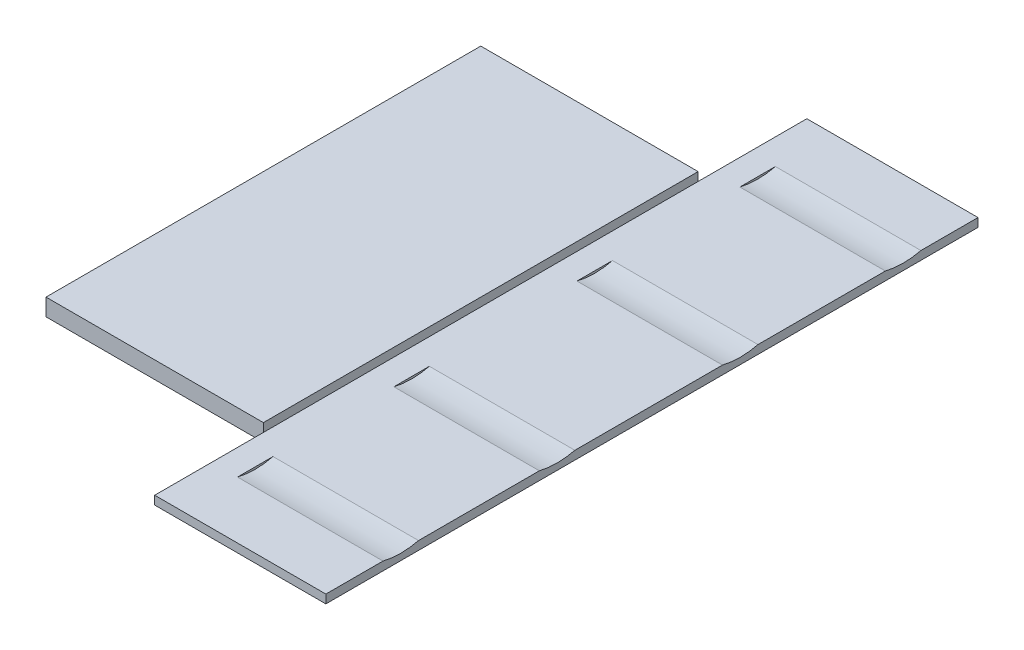
ISO-10303-21;
HEADER;
FILE_DESCRIPTION(('STEP AP214'),'2;1');
FILE_NAME('part.step','',(''),(''),'','','');
FILE_SCHEMA(('AUTOMOTIVE_DESIGN { 1 0 10303 214 1 1 1 1 }'));
ENDSEC;
DATA;
#1=APPLICATION_CONTEXT('core data for automotive mechanical design processes');
#2=APPLICATION_PROTOCOL_DEFINITION('international standard','automotive_design',2000,#1);
#3=PRODUCT_CONTEXT('',#1,'mechanical');
#4=PRODUCT('Part','Part','',(#3));
#5=PRODUCT_RELATED_PRODUCT_CATEGORY('part','',(#4));
#6=PRODUCT_DEFINITION_FORMATION('','',#4);
#7=PRODUCT_DEFINITION_CONTEXT('part definition',#1,'design');
#8=PRODUCT_DEFINITION('design','',#6,#7);
#9=PRODUCT_DEFINITION_SHAPE('','',#8);
#10=(LENGTH_UNIT() NAMED_UNIT(*) SI_UNIT(.MILLI.,.METRE.));
#11=(NAMED_UNIT(*) PLANE_ANGLE_UNIT() SI_UNIT($,.RADIAN.));
#12=(NAMED_UNIT(*) SI_UNIT($,.STERADIAN.) SOLID_ANGLE_UNIT());
#13=UNCERTAINTY_MEASURE_WITH_UNIT(LENGTH_MEASURE(1.E-05),#10,'distance_accuracy_value','');
#14=(GEOMETRIC_REPRESENTATION_CONTEXT(3) GLOBAL_UNCERTAINTY_ASSIGNED_CONTEXT((#13)) GLOBAL_UNIT_ASSIGNED_CONTEXT((#10,
#11,#12)) REPRESENTATION_CONTEXT('',''));
#15=CARTESIAN_POINT('',(0.,0.,0.));
#16=DIRECTION('',(0.,0.,1.));
#17=DIRECTION('',(1.,0.,0.));
#18=AXIS2_PLACEMENT_3D('',#15,#16,#17);
#19=CARTESIAN_POINT('',(-63.5,2.,-76.21));
#20=DIRECTION('',(0.,1.,0.));
#21=DIRECTION('',(0.,0.,1.));
#22=AXIS2_PLACEMENT_3D('',#19,#20,#21);
#23=PLANE('',#22);
#24=DIRECTION('',(1.,0.,0.));
#25=VECTOR('',#24,1.);
#26=CARTESIAN_POINT('',(0.,2.,-76.2));
#27=LINE('',#26,#25);
#28=CARTESIAN_POINT('',(-63.5,2.,-76.2));
#29=VERTEX_POINT('',#28);
#30=CARTESIAN_POINT('',(-23.5,2.,-76.2));
#31=VERTEX_POINT('',#30);
#32=EDGE_CURVE('E167',#29,#31,#27,.T.);
#33=ORIENTED_EDGE('',*,*,#32,.F.);
#34=DIRECTION('',(0.,0.,1.));
#35=VECTOR('',#34,1.);
#36=CARTESIAN_POINT('',(-63.5,2.,-76.21));
#37=LINE('',#36,#35);
#38=CARTESIAN_POINT('',(-63.5,2.,-50.8));
#39=VERTEX_POINT('',#38);
#40=EDGE_CURVE('E56',#29,#39,#37,.T.);
#41=ORIENTED_EDGE('',*,*,#40,.T.);
#42=CARTESIAN_POINT('',(-63.5,2.,50.8));
#43=VERTEX_POINT('',#42);
#44=EDGE_CURVE('E11',#39,#43,#37,.T.);
#45=ORIENTED_EDGE('',*,*,#44,.T.);
#46=CARTESIAN_POINT('',(-63.5,2.,76.2));
#47=VERTEX_POINT('',#46);
#48=EDGE_CURVE('E55',#43,#47,#37,.T.);
#49=ORIENTED_EDGE('',*,*,#48,.T.);
#50=DIRECTION('',(1.,0.,0.));
#51=VECTOR('',#50,1.);
#52=CARTESIAN_POINT('',(0.,2.,76.2));
#53=LINE('',#52,#51);
#54=CARTESIAN_POINT('',(-23.5,2.,76.2));
#55=VERTEX_POINT('',#54);
#56=EDGE_CURVE('E146',#47,#55,#53,.T.);
#57=ORIENTED_EDGE('',*,*,#56,.T.);
#58=DIRECTION('',(0.,0.,1.));
#59=VECTOR('',#58,1.);
#60=CARTESIAN_POINT('',(-23.5,2.,-76.21));
#61=LINE('',#60,#59);
#62=CARTESIAN_POINT('',(-23.5,2.00000000000001,62.8533119314591));
#63=VERTEX_POINT('',#62);
#64=EDGE_CURVE('E53',#63,#55,#61,.T.);
#65=ORIENTED_EDGE('',*,*,#64,.F.);
#66=DIRECTION('',(1.,0.,0.));
#67=VECTOR('',#66,1.);
#68=CARTESIAN_POINT('',(-57.5,2.00000000000001,62.8533119314592));
#69=LINE('',#68,#67);
#70=CARTESIAN_POINT('',(-57.5,2.,62.8533119314591));
#71=VERTEX_POINT('',#70);
#72=EDGE_CURVE('E210',#63,#71,#69,.F.);
#73=ORIENTED_EDGE('',*,*,#72,.T.);
#74=DIRECTION('',(0.,0.,1.));
#75=VECTOR('',#74,1.);
#76=CARTESIAN_POINT('',(-57.5,2.,58.7));
#77=LINE('',#76,#75);
#78=CARTESIAN_POINT('',(-57.5,2.,54.5466880685409));
#79=VERTEX_POINT('',#78);
#80=EDGE_CURVE('E155',#79,#71,#77,.T.);
#81=ORIENTED_EDGE('',*,*,#80,.F.);
#82=DIRECTION('',(1.,0.,0.));
#83=VECTOR('',#82,1.);
#84=CARTESIAN_POINT('',(-57.5,2.00000000000001,54.5466880685409));
#85=LINE('',#84,#83);
#86=CARTESIAN_POINT('',(-23.5,2.00000000000001,54.5466880685409));
#87=VERTEX_POINT('',#86);
#88=EDGE_CURVE('E216',#79,#87,#85,.T.);
#89=ORIENTED_EDGE('',*,*,#88,.T.);
#90=CARTESIAN_POINT('',(-23.5,2.00000000000001,26.3160118735668));
#91=VERTEX_POINT('',#90);
#92=EDGE_CURVE('E150',#91,#87,#61,.T.);
#93=ORIENTED_EDGE('',*,*,#92,.F.);
#94=DIRECTION('',(1.,0.,0.));
#95=VECTOR('',#94,1.);
#96=CARTESIAN_POINT('',(-57.5,2.00000000000001,26.3160118735668));
#97=LINE('',#96,#95);
#98=CARTESIAN_POINT('',(-57.5,2.,26.3160118735668));
#99=VERTEX_POINT('',#98);
#100=EDGE_CURVE('E183',#91,#99,#97,.F.);
#101=ORIENTED_EDGE('',*,*,#100,.T.);
#102=DIRECTION('',(0.,0.,1.));
#103=VECTOR('',#102,1.);
#104=CARTESIAN_POINT('',(-57.5,2.,22.1626999421077));
#105=LINE('',#104,#103);
#106=CARTESIAN_POINT('',(-57.5,2.,18.0093880106486));
#107=VERTEX_POINT('',#106);
#108=EDGE_CURVE('E164',#107,#99,#105,.T.);
#109=ORIENTED_EDGE('',*,*,#108,.F.);
#110=DIRECTION('',(1.,0.,0.));
#111=VECTOR('',#110,1.);
#112=CARTESIAN_POINT('',(-57.5,2.00000000000001,18.0093880106486));
#113=LINE('',#112,#111);
#114=CARTESIAN_POINT('',(-23.5,2.00000000000001,18.0093880106486));
#115=VERTEX_POINT('',#114);
#116=EDGE_CURVE('E189',#107,#115,#113,.T.);
#117=ORIENTED_EDGE('',*,*,#116,.T.);
#118=CARTESIAN_POINT('',(-23.5,2.00000000000001,-16.4795633231839));
#119=VERTEX_POINT('',#118);
#120=EDGE_CURVE('E244',#119,#115,#61,.T.);
#121=ORIENTED_EDGE('',*,*,#120,.F.);
#122=DIRECTION('',(1.,0.,0.));
#123=VECTOR('',#122,1.);
#124=CARTESIAN_POINT('',(-57.5,2.00000000000001,-16.4795633231839));
#125=LINE('',#124,#123);
#126=CARTESIAN_POINT('',(-57.5,2.,-16.4795633231839));
#127=VERTEX_POINT('',#126);
#128=EDGE_CURVE('E201',#119,#127,#125,.F.);
#129=ORIENTED_EDGE('',*,*,#128,.T.);
#130=DIRECTION('',(0.,0.,1.));
#131=VECTOR('',#130,1.);
#132=CARTESIAN_POINT('',(-57.5,2.,-20.632875254643));
#133=LINE('',#132,#131);
#134=CARTESIAN_POINT('',(-57.5,2.,-24.786187186102));
#135=VERTEX_POINT('',#134);
#136=EDGE_CURVE('E158',#135,#127,#133,.T.);
#137=ORIENTED_EDGE('',*,*,#136,.F.);
#138=DIRECTION('',(1.,0.,0.));
#139=VECTOR('',#138,1.);
#140=CARTESIAN_POINT('',(-57.5,2.00000000000001,-24.7861871861021));
#141=LINE('',#140,#139);
#142=CARTESIAN_POINT('',(-23.5,2.00000000000001,-24.7861871861021));
#143=VERTEX_POINT('',#142);
#144=EDGE_CURVE('E207',#135,#143,#141,.T.);
#145=ORIENTED_EDGE('',*,*,#144,.T.);
#146=CARTESIAN_POINT('',(-23.5,2.00000000000001,-54.5466880685409));
#147=VERTEX_POINT('',#146);
#148=EDGE_CURVE('E238',#147,#143,#61,.T.);
#149=ORIENTED_EDGE('',*,*,#148,.F.);
#150=DIRECTION('',(1.,0.,0.));
#151=VECTOR('',#150,1.);
#152=CARTESIAN_POINT('',(-57.5,2.00000000000001,-54.5466880685409));
#153=LINE('',#152,#151);
#154=CARTESIAN_POINT('',(-57.5,2.,-54.5466880685409));
#155=VERTEX_POINT('',#154);
#156=EDGE_CURVE('E192',#147,#155,#153,.F.);
#157=ORIENTED_EDGE('',*,*,#156,.T.);
#158=DIRECTION('',(0.,0.,1.));
#159=VECTOR('',#158,1.);
#160=CARTESIAN_POINT('',(-57.5,2.,-58.7));
#161=LINE('',#160,#159);
#162=CARTESIAN_POINT('',(-57.5,2.,-62.8533119314591));
#163=VERTEX_POINT('',#162);
#164=EDGE_CURVE('E161',#163,#155,#161,.T.);
#165=ORIENTED_EDGE('',*,*,#164,.F.);
#166=DIRECTION('',(1.,0.,0.));
#167=VECTOR('',#166,1.);
#168=CARTESIAN_POINT('',(-57.5,2.00000000000001,-62.8533119314591));
#169=LINE('',#168,#167);
#170=CARTESIAN_POINT('',(-23.5,2.00000000000001,-62.8533119314591));
#171=VERTEX_POINT('',#170);
#172=EDGE_CURVE('E198',#163,#171,#169,.T.);
#173=ORIENTED_EDGE('',*,*,#172,.T.);
#174=EDGE_CURVE('E151',#31,#171,#61,.T.);
#175=ORIENTED_EDGE('',*,*,#174,.F.);
#176=EDGE_LOOP('',(#33,#41,#45,#49,#57,#65,#73,#81,#89,#93,#101,#109,#117,#121,#129,#137,#145,
#149,#157,#165,#173,#175));
#177=FACE_BOUND('',#176,.T.);
#178=ADVANCED_FACE('F43',(#177),#23,.T.);
#179=CARTESIAN_POINT('',(-63.5,2.,-76.21));
#180=DIRECTION('',(1.,0.,0.));
#181=DIRECTION('',(0.,0.,-1.));
#182=AXIS2_PLACEMENT_3D('',#179,#180,#181);
#183=PLANE('',#182);
#184=DIRECTION('',(0.,0.,-1.));
#185=VECTOR('',#184,1.);
#186=CARTESIAN_POINT('',(-63.5,4.,0.));
#187=LINE('',#186,#185);
#188=CARTESIAN_POINT('',(-63.5,4.,50.8));
#189=VERTEX_POINT('',#188);
#190=CARTESIAN_POINT('',(-63.5,4.,-50.8));
#191=VERTEX_POINT('',#190);
#192=EDGE_CURVE('E173',#189,#191,#187,.T.);
#193=ORIENTED_EDGE('',*,*,#192,.F.);
#194=DIRECTION('',(0.,-1.,0.));
#195=VECTOR('',#194,1.);
#196=CARTESIAN_POINT('',(-63.5,4.,50.8));
#197=LINE('',#196,#195);
#198=EDGE_CURVE('E116',#189,#43,#197,.T.);
#199=ORIENTED_EDGE('',*,*,#198,.T.);
#200=ORIENTED_EDGE('',*,*,#44,.F.);
#201=DIRECTION('',(0.,-1.,0.));
#202=VECTOR('',#201,1.);
#203=CARTESIAN_POINT('',(-63.5,4.,-50.8));
#204=LINE('',#203,#202);
#205=EDGE_CURVE('E152',#191,#39,#204,.T.);
#206=ORIENTED_EDGE('',*,*,#205,.F.);
#207=EDGE_LOOP('',(#193,#199,#200,#206));
#208=FACE_BOUND('',#207,.T.);
#209=ADVANCED_FACE('F315',(#208),#183,.T.);
#210=CARTESIAN_POINT('',(-23.5,2.,-76.21));
#211=DIRECTION('',(1.,0.,0.));
#212=DIRECTION('',(0.,0.,-1.));
#213=AXIS2_PLACEMENT_3D('',#210,#211,#212);
#214=PLANE('',#213);
#215=DIRECTION('',(0.,-1.,0.));
#216=VECTOR('',#215,1.);
#217=CARTESIAN_POINT('',(-23.5,4.,-76.2));
#218=LINE('',#217,#216);
#219=CARTESIAN_POINT('',(-23.5,0.,-76.2));
#220=VERTEX_POINT('',#219);
#221=EDGE_CURVE('E170',#31,#220,#218,.T.);
#222=ORIENTED_EDGE('',*,*,#221,.F.);
#223=ORIENTED_EDGE('',*,*,#174,.T.);
#224=CARTESIAN_POINT('',(-23.5,19.,-58.7));
#225=DIRECTION('',(1.,0.,0.));
#226=DIRECTION('',(0.,0.,-1.));
#227=AXIS2_PLACEMENT_3D('',#224,#225,#226);
#228=CIRCLE('',#227,17.5);
#229=EDGE_CURVE('E195',#171,#147,#228,.F.);
#230=ORIENTED_EDGE('',*,*,#229,.T.);
#231=ORIENTED_EDGE('',*,*,#148,.T.);
#232=CARTESIAN_POINT('',(-23.5,19.,-20.632875254643));
#233=DIRECTION('',(1.,0.,0.));
#234=DIRECTION('',(0.,0.,-1.));
#235=AXIS2_PLACEMENT_3D('',#232,#233,#234);
#236=CIRCLE('',#235,17.5);
#237=EDGE_CURVE('E204',#143,#119,#236,.F.);
#238=ORIENTED_EDGE('',*,*,#237,.T.);
#239=ORIENTED_EDGE('',*,*,#120,.T.);
#240=CARTESIAN_POINT('',(-23.5,19.,22.1626999421077));
#241=DIRECTION('',(1.,0.,0.));
#242=DIRECTION('',(0.,0.,-1.));
#243=AXIS2_PLACEMENT_3D('',#240,#241,#242);
#244=CIRCLE('',#243,17.5);
#245=EDGE_CURVE('E186',#115,#91,#244,.F.);
#246=ORIENTED_EDGE('',*,*,#245,.T.);
#247=ORIENTED_EDGE('',*,*,#92,.T.);
#248=CARTESIAN_POINT('',(-23.5,19.,58.7));
#249=DIRECTION('',(1.,0.,0.));
#250=DIRECTION('',(0.,0.,-1.));
#251=AXIS2_PLACEMENT_3D('',#248,#249,#250);
#252=CIRCLE('',#251,17.5);
#253=EDGE_CURVE('E213',#87,#63,#252,.F.);
#254=ORIENTED_EDGE('',*,*,#253,.T.);
#255=ORIENTED_EDGE('',*,*,#64,.T.);
#256=DIRECTION('',(0.,-1.,0.));
#257=VECTOR('',#256,1.);
#258=CARTESIAN_POINT('',(-23.5,4.,76.2));
#259=LINE('',#258,#257);
#260=CARTESIAN_POINT('',(-23.5,0.,76.2));
#261=VERTEX_POINT('',#260);
#262=EDGE_CURVE('E176',#55,#261,#259,.T.);
#263=ORIENTED_EDGE('',*,*,#262,.T.);
#264=DIRECTION('',(0.,0.,-1.));
#265=VECTOR('',#264,1.);
#266=CARTESIAN_POINT('',(-23.5,0.,0.));
#267=LINE('',#266,#265);
#268=EDGE_CURVE('E147',#261,#220,#267,.T.);
#269=ORIENTED_EDGE('',*,*,#268,.T.);
#270=EDGE_LOOP('',(#222,#223,#230,#231,#238,#239,#246,#247,#254,#255,#263,#269));
#271=FACE_BOUND('',#270,.T.);
#272=ADVANCED_FACE('F253',(#271),#214,.T.);
#273=CARTESIAN_POINT('',(-57.5,19.,58.7));
#274=DIRECTION('',(1.,0.,0.));
#275=DIRECTION('',(0.,0.,-1.));
#276=AXIS2_PLACEMENT_3D('',#273,#274,#275);
#277=CYLINDRICAL_SURFACE('',#276,17.5);
#278=ORIENTED_EDGE('',*,*,#72,.F.);
#279=ORIENTED_EDGE('',*,*,#253,.F.);
#280=ORIENTED_EDGE('',*,*,#88,.F.);
#281=CARTESIAN_POINT('',(-57.5,19.,58.7));
#282=DIRECTION('',(1.,0.,0.));
#283=DIRECTION('',(0.,0.,-1.));
#284=AXIS2_PLACEMENT_3D('',#281,#282,#283);
#285=CIRCLE('',#284,17.5);
#286=EDGE_CURVE('E139',#71,#79,#285,.T.);
#287=ORIENTED_EDGE('',*,*,#286,.F.);
#288=EDGE_LOOP('',(#278,#279,#280,#287));
#289=FACE_BOUND('',#288,.T.);
#290=ADVANCED_FACE('F268',(#289),#277,.F.);
#291=CARTESIAN_POINT('',(-57.5,19.,58.7));
#292=DIRECTION('',(1.,0.,0.));
#293=DIRECTION('',(0.,0.,-1.));
#294=AXIS2_PLACEMENT_3D('',#291,#292,#293);
#295=PLANE('',#294);
#296=ORIENTED_EDGE('',*,*,#286,.T.);
#297=ORIENTED_EDGE('',*,*,#80,.T.);
#298=EDGE_LOOP('',(#296,#297));
#299=FACE_BOUND('',#298,.T.);
#300=ADVANCED_FACE('F334',(#299),#295,.T.);
#301=CARTESIAN_POINT('',(-57.5,19.,-20.632875254643));
#302=DIRECTION('',(1.,0.,0.));
#303=DIRECTION('',(0.,0.,-1.));
#304=AXIS2_PLACEMENT_3D('',#301,#302,#303);
#305=CYLINDRICAL_SURFACE('',#304,17.5);
#306=ORIENTED_EDGE('',*,*,#128,.F.);
#307=ORIENTED_EDGE('',*,*,#237,.F.);
#308=ORIENTED_EDGE('',*,*,#144,.F.);
#309=CARTESIAN_POINT('',(-57.5,19.,-20.632875254643));
#310=DIRECTION('',(1.,0.,0.));
#311=DIRECTION('',(0.,0.,-1.));
#312=AXIS2_PLACEMENT_3D('',#309,#310,#311);
#313=CIRCLE('',#312,17.5);
#314=EDGE_CURVE('E47',#127,#135,#313,.T.);
#315=ORIENTED_EDGE('',*,*,#314,.F.);
#316=EDGE_LOOP('',(#306,#307,#308,#315));
#317=FACE_BOUND('',#316,.T.);
#318=ADVANCED_FACE('F340',(#317),#305,.F.);
#319=CARTESIAN_POINT('',(-57.5,19.,-20.632875254643));
#320=DIRECTION('',(1.,0.,0.));
#321=DIRECTION('',(0.,0.,-1.));
#322=AXIS2_PLACEMENT_3D('',#319,#320,#321);
#323=PLANE('',#322);
#324=ORIENTED_EDGE('',*,*,#314,.T.);
#325=ORIENTED_EDGE('',*,*,#136,.T.);
#326=EDGE_LOOP('',(#324,#325));
#327=FACE_BOUND('',#326,.T.);
#328=ADVANCED_FACE('F348',(#327),#323,.T.);
#329=CARTESIAN_POINT('',(-57.5,19.,-58.7));
#330=DIRECTION('',(1.,0.,0.));
#331=DIRECTION('',(0.,0.,-1.));
#332=AXIS2_PLACEMENT_3D('',#329,#330,#331);
#333=CYLINDRICAL_SURFACE('',#332,17.5);
#334=ORIENTED_EDGE('',*,*,#156,.F.);
#335=ORIENTED_EDGE('',*,*,#229,.F.);
#336=ORIENTED_EDGE('',*,*,#172,.F.);
#337=CARTESIAN_POINT('',(-57.5,19.,-58.7));
#338=DIRECTION('',(1.,0.,0.));
#339=DIRECTION('',(0.,0.,-1.));
#340=AXIS2_PLACEMENT_3D('',#337,#338,#339);
#341=CIRCLE('',#340,17.5);
#342=EDGE_CURVE('E228',#155,#163,#341,.T.);
#343=ORIENTED_EDGE('',*,*,#342,.F.);
#344=EDGE_LOOP('',(#334,#335,#336,#343));
#345=FACE_BOUND('',#344,.T.);
#346=ADVANCED_FACE('F352',(#345),#333,.F.);
#347=CARTESIAN_POINT('',(-57.5,19.,-58.7));
#348=DIRECTION('',(1.,0.,0.));
#349=DIRECTION('',(0.,0.,-1.));
#350=AXIS2_PLACEMENT_3D('',#347,#348,#349);
#351=PLANE('',#350);
#352=ORIENTED_EDGE('',*,*,#342,.T.);
#353=ORIENTED_EDGE('',*,*,#164,.T.);
#354=EDGE_LOOP('',(#352,#353));
#355=FACE_BOUND('',#354,.T.);
#356=ADVANCED_FACE('F355',(#355),#351,.T.);
#357=CARTESIAN_POINT('',(-57.5,19.,22.1626999421077));
#358=DIRECTION('',(1.,0.,0.));
#359=DIRECTION('',(0.,0.,-1.));
#360=AXIS2_PLACEMENT_3D('',#357,#358,#359);
#361=CYLINDRICAL_SURFACE('',#360,17.5);
#362=ORIENTED_EDGE('',*,*,#100,.F.);
#363=ORIENTED_EDGE('',*,*,#245,.F.);
#364=ORIENTED_EDGE('',*,*,#116,.F.);
#365=CARTESIAN_POINT('',(-57.5,19.,22.1626999421077));
#366=DIRECTION('',(1.,0.,0.));
#367=DIRECTION('',(0.,0.,-1.));
#368=AXIS2_PLACEMENT_3D('',#365,#366,#367);
#369=CIRCLE('',#368,17.5);
#370=EDGE_CURVE('E226',#99,#107,#369,.T.);
#371=ORIENTED_EDGE('',*,*,#370,.F.);
#372=EDGE_LOOP('',(#362,#363,#364,#371));
#373=FACE_BOUND('',#372,.T.);
#374=ADVANCED_FACE('F359',(#373),#361,.F.);
#375=CARTESIAN_POINT('',(-57.5,19.,22.1626999421077));
#376=DIRECTION('',(1.,0.,0.));
#377=DIRECTION('',(0.,0.,-1.));
#378=AXIS2_PLACEMENT_3D('',#375,#376,#377);
#379=PLANE('',#378);
#380=ORIENTED_EDGE('',*,*,#370,.T.);
#381=ORIENTED_EDGE('',*,*,#108,.T.);
#382=EDGE_LOOP('',(#380,#381));
#383=FACE_BOUND('',#382,.T.);
#384=ADVANCED_FACE('F362',(#383),#379,.T.);
#385=CARTESIAN_POINT('',(0.,4.,0.));
#386=DIRECTION('',(0.,1.,0.));
#387=DIRECTION('',(0.,0.,1.));
#388=AXIS2_PLACEMENT_3D('',#385,#386,#387);
#389=PLANE('',#388);
#390=DIRECTION('',(1.,0.,0.));
#391=VECTOR('',#390,1.);
#392=CARTESIAN_POINT('',(0.,4.,50.8));
#393=LINE('',#392,#391);
#394=CARTESIAN_POINT('',(-114.3,4.,50.8));
#395=VERTEX_POINT('',#394);
#396=EDGE_CURVE('E140',#395,#189,#393,.T.);
#397=ORIENTED_EDGE('',*,*,#396,.T.);
#398=ORIENTED_EDGE('',*,*,#192,.T.);
#399=DIRECTION('',(1.,0.,0.));
#400=VECTOR('',#399,1.);
#401=CARTESIAN_POINT('',(0.,4.,-50.8));
#402=LINE('',#401,#400);
#403=CARTESIAN_POINT('',(-114.3,4.,-50.8));
#404=VERTEX_POINT('',#403);
#405=EDGE_CURVE('E143',#404,#191,#402,.T.);
#406=ORIENTED_EDGE('',*,*,#405,.F.);
#407=DIRECTION('',(0.,0.,1.));
#408=VECTOR('',#407,1.);
#409=CARTESIAN_POINT('',(-114.3,4.,0.));
#410=LINE('',#409,#408);
#411=EDGE_CURVE('E78',#404,#395,#410,.T.);
#412=ORIENTED_EDGE('',*,*,#411,.T.);
#413=EDGE_LOOP('',(#397,#398,#406,#412));
#414=FACE_BOUND('',#413,.T.);
#415=ADVANCED_FACE('F313',(#414),#389,.T.);
#416=CARTESIAN_POINT('',(0.,4.,-76.2));
#417=DIRECTION('',(0.,0.,-1.));
#418=DIRECTION('',(-1.,0.,0.));
#419=AXIS2_PLACEMENT_3D('',#416,#417,#418);
#420=PLANE('',#419);
#421=ORIENTED_EDGE('',*,*,#32,.T.);
#422=ORIENTED_EDGE('',*,*,#221,.T.);
#423=DIRECTION('',(1.,0.,0.));
#424=VECTOR('',#423,1.);
#425=CARTESIAN_POINT('',(0.,0.,-76.2));
#426=LINE('',#425,#424);
#427=CARTESIAN_POINT('',(-63.5,0.,-76.2));
#428=VERTEX_POINT('',#427);
#429=EDGE_CURVE('E130',#428,#220,#426,.T.);
#430=ORIENTED_EDGE('',*,*,#429,.F.);
#431=DIRECTION('',(0.,-1.,0.));
#432=VECTOR('',#431,1.);
#433=CARTESIAN_POINT('',(-63.5,4.,-76.2));
#434=LINE('',#433,#432);
#435=EDGE_CURVE('E154',#29,#428,#434,.T.);
#436=ORIENTED_EDGE('',*,*,#435,.F.);
#437=EDGE_LOOP('',(#421,#422,#430,#436));
#438=FACE_BOUND('',#437,.T.);
#439=ADVANCED_FACE('F367',(#438),#420,.T.);
#440=CARTESIAN_POINT('',(-63.5,4.,0.));
#441=DIRECTION('',(-1.,0.,0.));
#442=DIRECTION('',(0.,0.,1.));
#443=AXIS2_PLACEMENT_3D('',#440,#441,#442);
#444=PLANE('',#443);
#445=ORIENTED_EDGE('',*,*,#40,.F.);
#446=ORIENTED_EDGE('',*,*,#435,.T.);
#447=DIRECTION('',(0.,0.,-1.));
#448=VECTOR('',#447,1.);
#449=CARTESIAN_POINT('',(-63.5,0.,0.));
#450=LINE('',#449,#448);
#451=CARTESIAN_POINT('',(-63.5,0.,-50.8));
#452=VERTEX_POINT('',#451);
#453=EDGE_CURVE('E133',#452,#428,#450,.T.);
#454=ORIENTED_EDGE('',*,*,#453,.F.);
#455=EDGE_CURVE('E89',#39,#452,#204,.T.);
#456=ORIENTED_EDGE('',*,*,#455,.F.);
#457=EDGE_LOOP('',(#445,#446,#454,#456));
#458=FACE_BOUND('',#457,.T.);
#459=ADVANCED_FACE('F320',(#458),#444,.T.);
#460=CARTESIAN_POINT('',(0.,4.,-50.8));
#461=DIRECTION('',(0.,0.,-1.));
#462=DIRECTION('',(-1.,0.,0.));
#463=AXIS2_PLACEMENT_3D('',#460,#461,#462);
#464=PLANE('',#463);
#465=DIRECTION('',(1.,0.,0.));
#466=VECTOR('',#465,1.);
#467=CARTESIAN_POINT('',(0.,0.,-50.8));
#468=LINE('',#467,#466);
#469=CARTESIAN_POINT('',(-114.3,0.,-50.8));
#470=VERTEX_POINT('',#469);
#471=EDGE_CURVE('E137',#470,#452,#468,.T.);
#472=ORIENTED_EDGE('',*,*,#471,.F.);
#473=DIRECTION('',(0.,-1.,0.));
#474=VECTOR('',#473,1.);
#475=CARTESIAN_POINT('',(-114.3,4.,-50.8));
#476=LINE('',#475,#474);
#477=EDGE_CURVE('E64',#404,#470,#476,.T.);
#478=ORIENTED_EDGE('',*,*,#477,.F.);
#479=ORIENTED_EDGE('',*,*,#405,.T.);
#480=ORIENTED_EDGE('',*,*,#205,.T.);
#481=ORIENTED_EDGE('',*,*,#455,.T.);
#482=EDGE_LOOP('',(#472,#478,#479,#480,#481));
#483=FACE_BOUND('',#482,.T.);
#484=ADVANCED_FACE('F316',(#483),#464,.T.);
#485=CARTESIAN_POINT('',(-114.3,4.,0.));
#486=DIRECTION('',(1.,0.,0.));
#487=DIRECTION('',(0.,0.,-1.));
#488=AXIS2_PLACEMENT_3D('',#485,#486,#487);
#489=PLANE('',#488);
#490=DIRECTION('',(0.,0.,1.));
#491=VECTOR('',#490,1.);
#492=CARTESIAN_POINT('',(-114.3,0.,0.));
#493=LINE('',#492,#491);
#494=CARTESIAN_POINT('',(-114.3,0.,50.8));
#495=VERTEX_POINT('',#494);
#496=EDGE_CURVE('E123',#470,#495,#493,.T.);
#497=ORIENTED_EDGE('',*,*,#496,.T.);
#498=DIRECTION('',(0.,-1.,0.));
#499=VECTOR('',#498,1.);
#500=CARTESIAN_POINT('',(-114.3,4.,50.8));
#501=LINE('',#500,#499);
#502=EDGE_CURVE('E114',#395,#495,#501,.T.);
#503=ORIENTED_EDGE('',*,*,#502,.F.);
#504=ORIENTED_EDGE('',*,*,#411,.F.);
#505=ORIENTED_EDGE('',*,*,#477,.T.);
#506=EDGE_LOOP('',(#497,#503,#504,#505));
#507=FACE_BOUND('',#506,.T.);
#508=ADVANCED_FACE('F323',(#507),#489,.F.);
#509=CARTESIAN_POINT('',(0.,4.,50.8));
#510=DIRECTION('',(0.,0.,-1.));
#511=DIRECTION('',(-1.,0.,0.));
#512=AXIS2_PLACEMENT_3D('',#509,#510,#511);
#513=PLANE('',#512);
#514=DIRECTION('',(1.,0.,0.));
#515=VECTOR('',#514,1.);
#516=CARTESIAN_POINT('',(0.,0.,50.8));
#517=LINE('',#516,#515);
#518=CARTESIAN_POINT('',(-63.5,0.,50.8));
#519=VERTEX_POINT('',#518);
#520=EDGE_CURVE('E119',#495,#519,#517,.T.);
#521=ORIENTED_EDGE('',*,*,#520,.T.);
#522=EDGE_CURVE('E103',#43,#519,#197,.T.);
#523=ORIENTED_EDGE('',*,*,#522,.F.);
#524=ORIENTED_EDGE('',*,*,#198,.F.);
#525=ORIENTED_EDGE('',*,*,#396,.F.);
#526=ORIENTED_EDGE('',*,*,#502,.T.);
#527=EDGE_LOOP('',(#521,#523,#524,#525,#526));
#528=FACE_BOUND('',#527,.T.);
#529=ADVANCED_FACE('F120',(#528),#513,.F.);
#530=CARTESIAN_POINT('',(-63.5,4.,0.));
#531=DIRECTION('',(1.,0.,0.));
#532=DIRECTION('',(0.,0.,-1.));
#533=AXIS2_PLACEMENT_3D('',#530,#531,#532);
#534=PLANE('',#533);
#535=ORIENTED_EDGE('',*,*,#48,.F.);
#536=ORIENTED_EDGE('',*,*,#522,.T.);
#537=DIRECTION('',(0.,0.,1.));
#538=VECTOR('',#537,1.);
#539=CARTESIAN_POINT('',(-63.5,0.,0.));
#540=LINE('',#539,#538);
#541=CARTESIAN_POINT('',(-63.5,0.,76.2));
#542=VERTEX_POINT('',#541);
#543=EDGE_CURVE('E107',#519,#542,#540,.T.);
#544=ORIENTED_EDGE('',*,*,#543,.T.);
#545=DIRECTION('',(0.,-1.,0.));
#546=VECTOR('',#545,1.);
#547=CARTESIAN_POINT('',(-63.5,4.,76.2));
#548=LINE('',#547,#546);
#549=EDGE_CURVE('E113',#47,#542,#548,.T.);
#550=ORIENTED_EDGE('',*,*,#549,.F.);
#551=EDGE_LOOP('',(#535,#536,#544,#550));
#552=FACE_BOUND('',#551,.T.);
#553=ADVANCED_FACE('F45',(#552),#534,.F.);
#554=CARTESIAN_POINT('',(0.,4.,76.2));
#555=DIRECTION('',(0.,0.,-1.));
#556=DIRECTION('',(-1.,0.,0.));
#557=AXIS2_PLACEMENT_3D('',#554,#555,#556);
#558=PLANE('',#557);
#559=ORIENTED_EDGE('',*,*,#262,.F.);
#560=ORIENTED_EDGE('',*,*,#56,.F.);
#561=ORIENTED_EDGE('',*,*,#549,.T.);
#562=DIRECTION('',(1.,0.,0.));
#563=VECTOR('',#562,1.);
#564=CARTESIAN_POINT('',(0.,0.,76.2));
#565=LINE('',#564,#563);
#566=EDGE_CURVE('E128',#542,#261,#565,.T.);
#567=ORIENTED_EDGE('',*,*,#566,.T.);
#568=EDGE_LOOP('',(#559,#560,#561,#567));
#569=FACE_BOUND('',#568,.T.);
#570=ADVANCED_FACE('F372',(#569),#558,.F.);
#571=CARTESIAN_POINT('',(0.,0.,0.));
#572=DIRECTION('',(0.,1.,0.));
#573=DIRECTION('',(0.,0.,1.));
#574=AXIS2_PLACEMENT_3D('',#571,#572,#573);
#575=PLANE('',#574);
#576=ORIENTED_EDGE('',*,*,#268,.F.);
#577=ORIENTED_EDGE('',*,*,#566,.F.);
#578=ORIENTED_EDGE('',*,*,#543,.F.);
#579=ORIENTED_EDGE('',*,*,#520,.F.);
#580=ORIENTED_EDGE('',*,*,#496,.F.);
#581=ORIENTED_EDGE('',*,*,#471,.T.);
#582=ORIENTED_EDGE('',*,*,#453,.T.);
#583=ORIENTED_EDGE('',*,*,#429,.T.);
#584=EDGE_LOOP('',(#576,#577,#578,#579,#580,#581,#582,#583));
#585=FACE_BOUND('',#584,.T.);
#586=ADVANCED_FACE('F126',(#585),#575,.F.);
#587=CLOSED_SHELL('',(#178,#209,#272,#290,#300,#318,#328,#346,#356,#374,#384,#415,#439,#459,
#484,#508,#529,#553,#570,#586));
#588=MANIFOLD_SOLID_BREP('B2',#587);
#589=ADVANCED_BREP_SHAPE_REPRESENTATION('',(#18,#588),#14);
#590=SHAPE_DEFINITION_REPRESENTATION(#9,#589);
ENDSEC;
END-ISO-10303-21;
